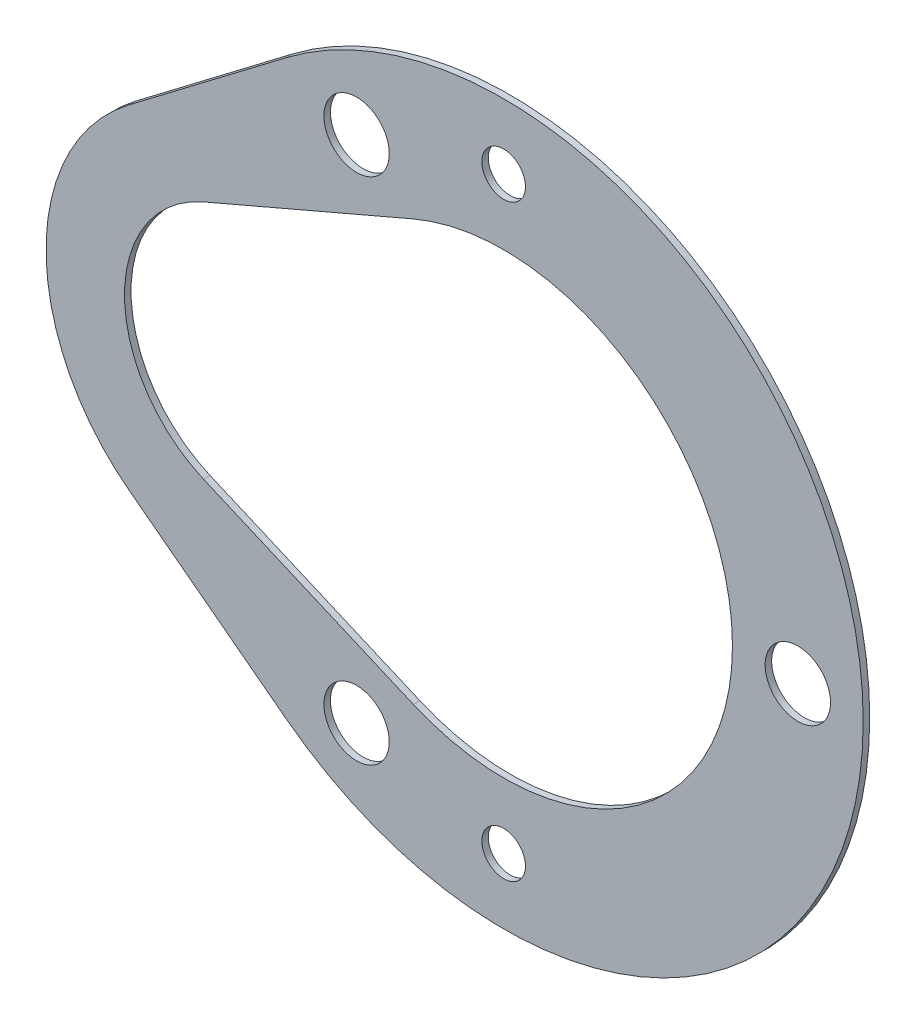
ISO-10303-21;
HEADER;
FILE_DESCRIPTION(('STEP AP214'),'2;1');
FILE_NAME('part.step','',(''),(''),'','','');
FILE_SCHEMA(('AUTOMOTIVE_DESIGN { 1 0 10303 214 1 1 1 1 }'));
ENDSEC;
DATA;
#1=APPLICATION_CONTEXT('core data for automotive mechanical design processes');
#2=APPLICATION_PROTOCOL_DEFINITION('international standard','automotive_design',2000,#1);
#3=PRODUCT_CONTEXT('',#1,'mechanical');
#4=PRODUCT('Part','Part','',(#3));
#5=PRODUCT_RELATED_PRODUCT_CATEGORY('part','',(#4));
#6=PRODUCT_DEFINITION_FORMATION('','',#4);
#7=PRODUCT_DEFINITION_CONTEXT('part definition',#1,'design');
#8=PRODUCT_DEFINITION('design','',#6,#7);
#9=PRODUCT_DEFINITION_SHAPE('','',#8);
#10=(LENGTH_UNIT() NAMED_UNIT(*) SI_UNIT(.MILLI.,.METRE.));
#11=(NAMED_UNIT(*) PLANE_ANGLE_UNIT() SI_UNIT($,.RADIAN.));
#12=(NAMED_UNIT(*) SI_UNIT($,.STERADIAN.) SOLID_ANGLE_UNIT());
#13=UNCERTAINTY_MEASURE_WITH_UNIT(LENGTH_MEASURE(1.E-05),#10,'distance_accuracy_value','');
#14=(GEOMETRIC_REPRESENTATION_CONTEXT(3) GLOBAL_UNCERTAINTY_ASSIGNED_CONTEXT((#13)) GLOBAL_UNIT_ASSIGNED_CONTEXT((#10,
#11,#12)) REPRESENTATION_CONTEXT('',''));
#15=CARTESIAN_POINT('',(0.,0.,0.));
#16=DIRECTION('',(0.,0.,1.));
#17=DIRECTION('',(1.,0.,0.));
#18=AXIS2_PLACEMENT_3D('',#15,#16,#17);
#19=CARTESIAN_POINT('',(-38.0000000000678,0.,1.));
#20=DIRECTION('',(0.,0.,1.));
#21=DIRECTION('',(1.,0.,0.));
#22=AXIS2_PLACEMENT_3D('',#19,#20,#21);
#23=PLANE('',#22);
#24=CARTESIAN_POINT('',(0.,-45.,1.));
#25=DIRECTION('',(0.,0.,1.));
#26=DIRECTION('',(1.,0.,0.));
#27=AXIS2_PLACEMENT_3D('',#24,#25,#26);
#28=CIRCLE('',#27,3.33333333333333);
#29=CARTESIAN_POINT('',(3.33333333333333,-45.,1.));
#30=VERTEX_POINT('',#29);
#31=EDGE_CURVE('E233',#30,#30,#28,.T.);
#32=ORIENTED_EDGE('',*,*,#31,.F.);
#33=EDGE_LOOP('',(#32));
#34=FACE_BOUND('',#33,.T.);
#35=CARTESIAN_POINT('',(0.,45.,1.));
#36=DIRECTION('',(0.,0.,1.));
#37=DIRECTION('',(1.,0.,0.));
#38=AXIS2_PLACEMENT_3D('',#35,#36,#37);
#39=CIRCLE('',#38,3.33333333333333);
#40=CARTESIAN_POINT('',(3.33333333333333,45.,1.));
#41=VERTEX_POINT('',#40);
#42=EDGE_CURVE('E155',#41,#41,#39,.T.);
#43=ORIENTED_EDGE('',*,*,#42,.F.);
#44=EDGE_LOOP('',(#43));
#45=FACE_BOUND('',#44,.T.);
#46=CARTESIAN_POINT('',(45.,0.,1.));
#47=DIRECTION('',(0.,0.,1.));
#48=DIRECTION('',(1.,0.,0.));
#49=AXIS2_PLACEMENT_3D('',#46,#47,#48);
#50=CIRCLE('',#49,4.99999999999204);
#51=CARTESIAN_POINT('',(49.999999999992,0.,1.));
#52=VERTEX_POINT('',#51);
#53=EDGE_CURVE('E179',#52,#52,#50,.T.);
#54=ORIENTED_EDGE('',*,*,#53,.F.);
#55=EDGE_LOOP('',(#54));
#56=FACE_BOUND('',#55,.T.);
#57=CARTESIAN_POINT('',(-38.0000000000678,0.,1.));
#58=DIRECTION('',(0.,0.,1.));
#59=DIRECTION('',(1.,0.,0.));
#60=AXIS2_PLACEMENT_3D('',#57,#58,#59);
#61=CIRCLE('',#60,31.999999978855);
#62=CARTESIAN_POINT('',(-57.3684210279545,25.4728142444692,1.));
#63=VERTEX_POINT('',#62);
#64=CARTESIAN_POINT('',(-57.3684210279545,-25.4728142444692,1.));
#65=VERTEX_POINT('',#64);
#66=EDGE_CURVE('E195',#63,#65,#61,.T.);
#67=ORIENTED_EDGE('',*,*,#66,.T.);
#68=DIRECTION('',(0.796025445665663,-0.605263157521406,0.));
#69=VECTOR('',#68,1.);
#70=CARTESIAN_POINT('',(-57.3684210279545,-25.4728142444692,1.));
#71=LINE('',#70,#69);
#72=CARTESIAN_POINT('',(-33.2894736423173,-43.7813994835193,1.));
#73=VERTEX_POINT('',#72);
#74=EDGE_CURVE('E199',#65,#73,#71,.T.);
#75=ORIENTED_EDGE('',*,*,#74,.T.);
#76=CARTESIAN_POINT('',(0.,0.,1.));
#77=DIRECTION('',(0.,0.,1.));
#78=DIRECTION('',(1.,0.,0.));
#79=AXIS2_PLACEMENT_3D('',#76,#77,#78);
#80=CIRCLE('',#79,54.9999999647095);
#81=CARTESIAN_POINT('',(-33.2894736423173,43.7813994835193,1.));
#82=VERTEX_POINT('',#81);
#83=EDGE_CURVE('E203',#73,#82,#80,.T.);
#84=ORIENTED_EDGE('',*,*,#83,.T.);
#85=DIRECTION('',(-0.796025445665663,-0.605263157521406,0.));
#86=VECTOR('',#85,1.);
#87=CARTESIAN_POINT('',(-57.3684210279545,25.4728142444692,1.));
#88=LINE('',#87,#86);
#89=EDGE_CURVE('E206',#82,#63,#88,.T.);
#90=ORIENTED_EDGE('',*,*,#89,.T.);
#91=EDGE_LOOP('',(#67,#75,#84,#90));
#92=FACE_BOUND('',#91,.T.);
#93=CARTESIAN_POINT('',(-22.5000000000002,38.9711431702724,1.));
#94=DIRECTION('',(0.,0.,1.));
#95=DIRECTION('',(1.,0.,0.));
#96=AXIS2_PLACEMENT_3D('',#93,#94,#95);
#97=CIRCLE('',#96,5.00000000000001);
#98=CARTESIAN_POINT('',(-17.5000000000002,38.9711431702724,1.));
#99=VERTEX_POINT('',#98);
#100=EDGE_CURVE('E187',#99,#99,#97,.T.);
#101=ORIENTED_EDGE('',*,*,#100,.F.);
#102=EDGE_LOOP('',(#101));
#103=FACE_BOUND('',#102,.T.);
#104=CARTESIAN_POINT('',(-22.4999999999996,-38.9711431703272,1.));
#105=DIRECTION('',(0.,0.,1.));
#106=DIRECTION('',(1.,0.,0.));
#107=AXIS2_PLACEMENT_3D('',#104,#105,#106);
#108=CIRCLE('',#107,5.00000000000001);
#109=CARTESIAN_POINT('',(-17.4999999999996,-38.9711431703272,1.));
#110=VERTEX_POINT('',#109);
#111=EDGE_CURVE('E171',#110,#110,#108,.T.);
#112=ORIENTED_EDGE('',*,*,#111,.F.);
#113=EDGE_LOOP('',(#112));
#114=FACE_BOUND('',#113,.T.);
#115=DIRECTION('',(-0.91879422368957,-0.39473684210456,0.));
#116=VECTOR('',#115,1.);
#117=CARTESIAN_POINT('',(-45.8947368421589,18.3758844737914,1.));
#118=LINE('',#117,#116);
#119=CARTESIAN_POINT('',(-13.8157894736596,32.157797829135,1.));
#120=VERTEX_POINT('',#119);
#121=CARTESIAN_POINT('',(-45.8947368421589,18.3758844737914,1.));
#122=VERTEX_POINT('',#121);
#123=EDGE_CURVE('E130',#120,#122,#118,.T.);
#124=ORIENTED_EDGE('',*,*,#123,.F.);
#125=CARTESIAN_POINT('',(0.,0.,1.));
#126=DIRECTION('',(0.,0.,1.));
#127=DIRECTION('',(1.,0.,0.));
#128=AXIS2_PLACEMENT_3D('',#125,#126,#127);
#129=CIRCLE('',#128,35.);
#130=CARTESIAN_POINT('',(-13.8157894736596,-32.157797829135,1.));
#131=VERTEX_POINT('',#130);
#132=EDGE_CURVE('E121',#131,#120,#129,.T.);
#133=ORIENTED_EDGE('',*,*,#132,.F.);
#134=DIRECTION('',(0.91879422368957,-0.39473684210456,0.));
#135=VECTOR('',#134,1.);
#136=CARTESIAN_POINT('',(-45.8947368421589,-18.3758844737914,1.));
#137=LINE('',#136,#135);
#138=CARTESIAN_POINT('',(-45.8947368421589,-18.3758844737914,1.));
#139=VERTEX_POINT('',#138);
#140=EDGE_CURVE('E147',#139,#131,#137,.T.);
#141=ORIENTED_EDGE('',*,*,#140,.F.);
#142=CARTESIAN_POINT('',(-38.0000000000678,0.,1.));
#143=DIRECTION('',(0.,0.,1.));
#144=DIRECTION('',(1.,0.,0.));
#145=AXIS2_PLACEMENT_3D('',#142,#143,#144);
#146=CIRCLE('',#145,20.);
#147=EDGE_CURVE('E143',#122,#139,#146,.T.);
#148=ORIENTED_EDGE('',*,*,#147,.F.);
#149=EDGE_LOOP('',(#124,#133,#141,#148));
#150=FACE_BOUND('',#149,.T.);
#151=ADVANCED_FACE('F53',(#34,#45,#56,#92,#103,#114,#150),#23,.T.);
#152=CARTESIAN_POINT('',(-38.0000000000678,0.,0.));
#153=DIRECTION('',(0.,0.,1.));
#154=DIRECTION('',(1.,0.,0.));
#155=AXIS2_PLACEMENT_3D('',#152,#153,#154);
#156=PLANE('',#155);
#157=CARTESIAN_POINT('',(0.,-45.,0.));
#158=DIRECTION('',(0.,0.,1.));
#159=DIRECTION('',(1.,0.,0.));
#160=AXIS2_PLACEMENT_3D('',#157,#158,#159);
#161=CIRCLE('',#160,3.35);
#162=CARTESIAN_POINT('',(3.35,-45.,0.));
#163=VERTEX_POINT('',#162);
#164=EDGE_CURVE('E57',#163,#163,#161,.T.);
#165=ORIENTED_EDGE('',*,*,#164,.T.);
#166=EDGE_LOOP('',(#165));
#167=FACE_BOUND('',#166,.T.);
#168=CARTESIAN_POINT('',(0.,45.,0.));
#169=DIRECTION('',(0.,0.,1.));
#170=DIRECTION('',(1.,0.,0.));
#171=AXIS2_PLACEMENT_3D('',#168,#169,#170);
#172=CIRCLE('',#171,3.35);
#173=CARTESIAN_POINT('',(3.35,45.,0.));
#174=VERTEX_POINT('',#173);
#175=EDGE_CURVE('E230',#174,#174,#172,.T.);
#176=ORIENTED_EDGE('',*,*,#175,.T.);
#177=EDGE_LOOP('',(#176));
#178=FACE_BOUND('',#177,.T.);
#179=CARTESIAN_POINT('',(-22.4999999999996,-38.9711431703272,0.));
#180=DIRECTION('',(0.,0.,1.));
#181=DIRECTION('',(1.,0.,0.));
#182=AXIS2_PLACEMENT_3D('',#179,#180,#181);
#183=CIRCLE('',#182,5.00000000000001);
#184=CARTESIAN_POINT('',(-17.4999999999996,-38.9711431703272,0.));
#185=VERTEX_POINT('',#184);
#186=EDGE_CURVE('E139',#185,#185,#183,.T.);
#187=ORIENTED_EDGE('',*,*,#186,.T.);
#188=EDGE_LOOP('',(#187));
#189=FACE_BOUND('',#188,.T.);
#190=CARTESIAN_POINT('',(45.,0.,0.));
#191=DIRECTION('',(0.,0.,1.));
#192=DIRECTION('',(1.,0.,0.));
#193=AXIS2_PLACEMENT_3D('',#190,#191,#192);
#194=CIRCLE('',#193,4.99999999999204);
#195=CARTESIAN_POINT('',(49.999999999992,0.,0.));
#196=VERTEX_POINT('',#195);
#197=EDGE_CURVE('E175',#196,#196,#194,.T.);
#198=ORIENTED_EDGE('',*,*,#197,.T.);
#199=EDGE_LOOP('',(#198));
#200=FACE_BOUND('',#199,.T.);
#201=CARTESIAN_POINT('',(-22.5000000000002,38.9711431702724,0.));
#202=DIRECTION('',(0.,0.,1.));
#203=DIRECTION('',(1.,0.,0.));
#204=AXIS2_PLACEMENT_3D('',#201,#202,#203);
#205=CIRCLE('',#204,5.00000000000001);
#206=CARTESIAN_POINT('',(-17.5000000000002,38.9711431702724,0.));
#207=VERTEX_POINT('',#206);
#208=EDGE_CURVE('E183',#207,#207,#205,.T.);
#209=ORIENTED_EDGE('',*,*,#208,.T.);
#210=EDGE_LOOP('',(#209));
#211=FACE_BOUND('',#210,.T.);
#212=CARTESIAN_POINT('',(-38.0000000000678,0.,0.));
#213=DIRECTION('',(0.,0.,1.));
#214=DIRECTION('',(1.,0.,0.));
#215=AXIS2_PLACEMENT_3D('',#212,#213,#214);
#216=CIRCLE('',#215,31.999999978855);
#217=CARTESIAN_POINT('',(-57.3684210279545,25.4728142444692,0.));
#218=VERTEX_POINT('',#217);
#219=CARTESIAN_POINT('',(-57.3684210279545,-25.4728142444692,0.));
#220=VERTEX_POINT('',#219);
#221=EDGE_CURVE('E191',#218,#220,#216,.T.);
#222=ORIENTED_EDGE('',*,*,#221,.F.);
#223=DIRECTION('',(-0.796025445665663,-0.605263157521406,0.));
#224=VECTOR('',#223,1.);
#225=CARTESIAN_POINT('',(-57.3684210279545,25.4728142444692,0.));
#226=LINE('',#225,#224);
#227=CARTESIAN_POINT('',(-33.2894736423173,43.7813994835193,0.));
#228=VERTEX_POINT('',#227);
#229=EDGE_CURVE('E200',#228,#218,#226,.T.);
#230=ORIENTED_EDGE('',*,*,#229,.F.);
#231=CARTESIAN_POINT('',(0.,0.,0.));
#232=DIRECTION('',(0.,0.,1.));
#233=DIRECTION('',(1.,0.,0.));
#234=AXIS2_PLACEMENT_3D('',#231,#232,#233);
#235=CIRCLE('',#234,54.9999999647095);
#236=CARTESIAN_POINT('',(-33.2894736423173,-43.7813994835193,0.));
#237=VERTEX_POINT('',#236);
#238=EDGE_CURVE('E216',#237,#228,#235,.T.);
#239=ORIENTED_EDGE('',*,*,#238,.F.);
#240=DIRECTION('',(0.796025445665663,-0.605263157521406,0.));
#241=VECTOR('',#240,1.);
#242=CARTESIAN_POINT('',(-57.3684210279545,-25.4728142444692,0.));
#243=LINE('',#242,#241);
#244=EDGE_CURVE('E213',#220,#237,#243,.T.);
#245=ORIENTED_EDGE('',*,*,#244,.F.);
#246=EDGE_LOOP('',(#222,#230,#239,#245));
#247=FACE_BOUND('',#246,.T.);
#248=CARTESIAN_POINT('',(0.,0.,0.));
#249=DIRECTION('',(0.,0.,1.));
#250=DIRECTION('',(1.,0.,0.));
#251=AXIS2_PLACEMENT_3D('',#248,#249,#250);
#252=CIRCLE('',#251,35.);
#253=CARTESIAN_POINT('',(-13.8157894736596,-32.157797829135,0.));
#254=VERTEX_POINT('',#253);
#255=CARTESIAN_POINT('',(-13.8157894736596,32.157797829135,0.));
#256=VERTEX_POINT('',#255);
#257=EDGE_CURVE('E79',#254,#256,#252,.T.);
#258=ORIENTED_EDGE('',*,*,#257,.T.);
#259=DIRECTION('',(-0.91879422368957,-0.39473684210456,0.));
#260=VECTOR('',#259,1.);
#261=CARTESIAN_POINT('',(-45.8947368421589,18.3758844737914,0.));
#262=LINE('',#261,#260);
#263=CARTESIAN_POINT('',(-45.8947368421589,18.3758844737914,0.));
#264=VERTEX_POINT('',#263);
#265=EDGE_CURVE('E137',#256,#264,#262,.T.);
#266=ORIENTED_EDGE('',*,*,#265,.T.);
#267=CARTESIAN_POINT('',(-38.0000000000678,0.,0.));
#268=DIRECTION('',(0.,0.,1.));
#269=DIRECTION('',(1.,0.,0.));
#270=AXIS2_PLACEMENT_3D('',#267,#268,#269);
#271=CIRCLE('',#270,20.);
#272=CARTESIAN_POINT('',(-45.8947368421589,-18.3758844737914,0.));
#273=VERTEX_POINT('',#272);
#274=EDGE_CURVE('E158',#264,#273,#271,.T.);
#275=ORIENTED_EDGE('',*,*,#274,.T.);
#276=DIRECTION('',(0.91879422368957,-0.39473684210456,0.));
#277=VECTOR('',#276,1.);
#278=CARTESIAN_POINT('',(-45.8947368421589,-18.3758844737914,0.));
#279=LINE('',#278,#277);
#280=EDGE_CURVE('E131',#273,#254,#279,.T.);
#281=ORIENTED_EDGE('',*,*,#280,.T.);
#282=EDGE_LOOP('',(#258,#266,#275,#281));
#283=FACE_BOUND('',#282,.T.);
#284=ADVANCED_FACE('F247',(#167,#178,#189,#200,#211,#247,#283),#156,.F.);
#285=CARTESIAN_POINT('',(-38.0000000000678,0.,1.));
#286=DIRECTION('',(0.,0.,-1.));
#287=DIRECTION('',(-1.,0.,0.));
#288=AXIS2_PLACEMENT_3D('',#285,#286,#287);
#289=CYLINDRICAL_SURFACE('',#288,31.999999978855);
#290=ORIENTED_EDGE('',*,*,#221,.T.);
#291=DIRECTION('',(0.,0.,-1.));
#292=VECTOR('',#291,1.);
#293=CARTESIAN_POINT('',(-57.3684210279545,-25.4728142444692,1.));
#294=LINE('',#293,#292);
#295=EDGE_CURVE('E12',#65,#220,#294,.T.);
#296=ORIENTED_EDGE('',*,*,#295,.F.);
#297=ORIENTED_EDGE('',*,*,#66,.F.);
#298=DIRECTION('',(0.,0.,-1.));
#299=VECTOR('',#298,1.);
#300=CARTESIAN_POINT('',(-57.3684210279545,25.4728142444692,1.));
#301=LINE('',#300,#299);
#302=EDGE_CURVE('E209',#63,#218,#301,.T.);
#303=ORIENTED_EDGE('',*,*,#302,.T.);
#304=EDGE_LOOP('',(#290,#296,#297,#303));
#305=FACE_BOUND('',#304,.T.);
#306=ADVANCED_FACE('F55',(#305),#289,.T.);
#307=CARTESIAN_POINT('',(-57.3684210279545,-25.4728142444692,1.));
#308=DIRECTION('',(0.605263157521406,0.796025445665663,0.));
#309=DIRECTION('',(-0.796025445665663,0.605263157521406,0.));
#310=AXIS2_PLACEMENT_3D('',#307,#308,#309);
#311=PLANE('',#310);
#312=ORIENTED_EDGE('',*,*,#244,.T.);
#313=DIRECTION('',(0.,0.,-1.));
#314=VECTOR('',#313,1.);
#315=CARTESIAN_POINT('',(-33.2894736423173,-43.7813994835193,1.));
#316=LINE('',#315,#314);
#317=EDGE_CURVE('E63',#73,#237,#316,.T.);
#318=ORIENTED_EDGE('',*,*,#317,.F.);
#319=ORIENTED_EDGE('',*,*,#74,.F.);
#320=ORIENTED_EDGE('',*,*,#295,.T.);
#321=EDGE_LOOP('',(#312,#318,#319,#320));
#322=FACE_BOUND('',#321,.T.);
#323=ADVANCED_FACE('F277',(#322),#311,.F.);
#324=CARTESIAN_POINT('',(0.,0.,1.));
#325=DIRECTION('',(0.,0.,-1.));
#326=DIRECTION('',(-1.,0.,0.));
#327=AXIS2_PLACEMENT_3D('',#324,#325,#326);
#328=CYLINDRICAL_SURFACE('',#327,54.9999999647095);
#329=ORIENTED_EDGE('',*,*,#238,.T.);
#330=DIRECTION('',(0.,0.,-1.));
#331=VECTOR('',#330,1.);
#332=CARTESIAN_POINT('',(-33.2894736423173,43.7813994835193,1.));
#333=LINE('',#332,#331);
#334=EDGE_CURVE('E224',#82,#228,#333,.T.);
#335=ORIENTED_EDGE('',*,*,#334,.F.);
#336=ORIENTED_EDGE('',*,*,#83,.F.);
#337=ORIENTED_EDGE('',*,*,#317,.T.);
#338=EDGE_LOOP('',(#329,#335,#336,#337));
#339=FACE_BOUND('',#338,.T.);
#340=ADVANCED_FACE('F274',(#339),#328,.T.);
#341=CARTESIAN_POINT('',(-57.3684210279545,25.4728142444692,1.));
#342=DIRECTION('',(0.605263157521406,-0.796025445665663,0.));
#343=DIRECTION('',(0.796025445665663,0.605263157521406,0.));
#344=AXIS2_PLACEMENT_3D('',#341,#342,#343);
#345=PLANE('',#344);
#346=ORIENTED_EDGE('',*,*,#229,.T.);
#347=ORIENTED_EDGE('',*,*,#302,.F.);
#348=ORIENTED_EDGE('',*,*,#89,.F.);
#349=ORIENTED_EDGE('',*,*,#334,.T.);
#350=EDGE_LOOP('',(#346,#347,#348,#349));
#351=FACE_BOUND('',#350,.T.);
#352=ADVANCED_FACE('F271',(#351),#345,.F.);
#353=CARTESIAN_POINT('',(-22.5000000000002,38.9711431702724,1.));
#354=DIRECTION('',(0.,0.,-1.));
#355=DIRECTION('',(-1.,0.,0.));
#356=AXIS2_PLACEMENT_3D('',#353,#354,#355);
#357=CYLINDRICAL_SURFACE('',#356,5.00000000000001);
#358=ORIENTED_EDGE('',*,*,#100,.T.);
#359=EDGE_LOOP('',(#358));
#360=FACE_BOUND('',#359,.T.);
#361=ORIENTED_EDGE('',*,*,#208,.F.);
#362=EDGE_LOOP('',(#361));
#363=FACE_BOUND('',#362,.T.);
#364=ADVANCED_FACE('F268',(#360,#363),#357,.F.);
#365=CARTESIAN_POINT('',(45.,0.,1.));
#366=DIRECTION('',(0.,0.,-1.));
#367=DIRECTION('',(-1.,0.,0.));
#368=AXIS2_PLACEMENT_3D('',#365,#366,#367);
#369=CYLINDRICAL_SURFACE('',#368,4.99999999999204);
#370=ORIENTED_EDGE('',*,*,#53,.T.);
#371=EDGE_LOOP('',(#370));
#372=FACE_BOUND('',#371,.T.);
#373=ORIENTED_EDGE('',*,*,#197,.F.);
#374=EDGE_LOOP('',(#373));
#375=FACE_BOUND('',#374,.T.);
#376=ADVANCED_FACE('F306',(#372,#375),#369,.F.);
#377=CARTESIAN_POINT('',(-22.4999999999996,-38.9711431703272,1.));
#378=DIRECTION('',(0.,0.,-1.));
#379=DIRECTION('',(-1.,0.,0.));
#380=AXIS2_PLACEMENT_3D('',#377,#378,#379);
#381=CYLINDRICAL_SURFACE('',#380,5.00000000000001);
#382=ORIENTED_EDGE('',*,*,#111,.T.);
#383=EDGE_LOOP('',(#382));
#384=FACE_BOUND('',#383,.T.);
#385=ORIENTED_EDGE('',*,*,#186,.F.);
#386=EDGE_LOOP('',(#385));
#387=FACE_BOUND('',#386,.T.);
#388=ADVANCED_FACE('F303',(#384,#387),#381,.F.);
#389=CARTESIAN_POINT('',(0.,0.,1.));
#390=DIRECTION('',(0.,0.,-1.));
#391=DIRECTION('',(-1.,0.,0.));
#392=AXIS2_PLACEMENT_3D('',#389,#390,#391);
#393=CYLINDRICAL_SURFACE('',#392,35.);
#394=ORIENTED_EDGE('',*,*,#257,.F.);
#395=DIRECTION('',(0.,0.,-1.));
#396=VECTOR('',#395,1.);
#397=CARTESIAN_POINT('',(-13.8157894736596,-32.157797829135,1.));
#398=LINE('',#397,#396);
#399=EDGE_CURVE('E125',#131,#254,#398,.T.);
#400=ORIENTED_EDGE('',*,*,#399,.F.);
#401=ORIENTED_EDGE('',*,*,#132,.T.);
#402=DIRECTION('',(0.,0.,-1.));
#403=VECTOR('',#402,1.);
#404=CARTESIAN_POINT('',(-13.8157894736596,32.157797829135,1.));
#405=LINE('',#404,#403);
#406=EDGE_CURVE('E124',#120,#256,#405,.T.);
#407=ORIENTED_EDGE('',*,*,#406,.T.);
#408=EDGE_LOOP('',(#394,#400,#401,#407));
#409=FACE_BOUND('',#408,.T.);
#410=ADVANCED_FACE('F123',(#409),#393,.F.);
#411=CARTESIAN_POINT('',(-45.8947368421589,18.3758844737914,1.));
#412=DIRECTION('',(0.39473684210456,-0.91879422368957,0.));
#413=DIRECTION('',(0.91879422368957,0.39473684210456,0.));
#414=AXIS2_PLACEMENT_3D('',#411,#412,#413);
#415=PLANE('',#414);
#416=ORIENTED_EDGE('',*,*,#265,.F.);
#417=ORIENTED_EDGE('',*,*,#406,.F.);
#418=ORIENTED_EDGE('',*,*,#123,.T.);
#419=DIRECTION('',(0.,0.,-1.));
#420=VECTOR('',#419,1.);
#421=CARTESIAN_POINT('',(-45.8947368421589,18.3758844737914,1.));
#422=LINE('',#421,#420);
#423=EDGE_CURVE('E140',#122,#264,#422,.T.);
#424=ORIENTED_EDGE('',*,*,#423,.T.);
#425=EDGE_LOOP('',(#416,#417,#418,#424));
#426=FACE_BOUND('',#425,.T.);
#427=ADVANCED_FACE('F134',(#426),#415,.T.);
#428=CARTESIAN_POINT('',(-38.0000000000678,0.,1.));
#429=DIRECTION('',(0.,0.,-1.));
#430=DIRECTION('',(-1.,0.,0.));
#431=AXIS2_PLACEMENT_3D('',#428,#429,#430);
#432=CYLINDRICAL_SURFACE('',#431,20.);
#433=ORIENTED_EDGE('',*,*,#274,.F.);
#434=ORIENTED_EDGE('',*,*,#423,.F.);
#435=ORIENTED_EDGE('',*,*,#147,.T.);
#436=DIRECTION('',(0.,0.,-1.));
#437=VECTOR('',#436,1.);
#438=CARTESIAN_POINT('',(-45.8947368421589,-18.3758844737914,1.));
#439=LINE('',#438,#437);
#440=EDGE_CURVE('E71',#139,#273,#439,.T.);
#441=ORIENTED_EDGE('',*,*,#440,.T.);
#442=EDGE_LOOP('',(#433,#434,#435,#441));
#443=FACE_BOUND('',#442,.T.);
#444=ADVANCED_FACE('F329',(#443),#432,.F.);
#445=CARTESIAN_POINT('',(-45.8947368421589,-18.3758844737914,1.));
#446=DIRECTION('',(0.39473684210456,0.91879422368957,0.));
#447=DIRECTION('',(-0.91879422368957,0.39473684210456,0.));
#448=AXIS2_PLACEMENT_3D('',#445,#446,#447);
#449=PLANE('',#448);
#450=ORIENTED_EDGE('',*,*,#280,.F.);
#451=ORIENTED_EDGE('',*,*,#440,.F.);
#452=ORIENTED_EDGE('',*,*,#140,.T.);
#453=ORIENTED_EDGE('',*,*,#399,.T.);
#454=EDGE_LOOP('',(#450,#451,#452,#453));
#455=FACE_BOUND('',#454,.T.);
#456=ADVANCED_FACE('F256',(#455),#449,.T.);
#457=CARTESIAN_POINT('',(0.,45.,21.));
#458=DIRECTION('',(0.,0.,-1.));
#459=DIRECTION('',(-1.,0.,0.));
#460=AXIS2_PLACEMENT_3D('',#457,#458,#459);
#461=CONICAL_SURFACE('',#460,3.,0.0166651237139407);
#462=ORIENTED_EDGE('',*,*,#42,.T.);
#463=EDGE_LOOP('',(#462));
#464=FACE_BOUND('',#463,.T.);
#465=ORIENTED_EDGE('',*,*,#175,.F.);
#466=EDGE_LOOP('',(#465));
#467=FACE_BOUND('',#466,.T.);
#468=ADVANCED_FACE('F251',(#464,#467),#461,.F.);
#469=CARTESIAN_POINT('',(0.,-45.,21.));
#470=DIRECTION('',(0.,0.,-1.));
#471=DIRECTION('',(-1.,0.,0.));
#472=AXIS2_PLACEMENT_3D('',#469,#470,#471);
#473=CONICAL_SURFACE('',#472,3.,0.0166651237139407);
#474=ORIENTED_EDGE('',*,*,#31,.T.);
#475=EDGE_LOOP('',(#474));
#476=FACE_BOUND('',#475,.T.);
#477=ORIENTED_EDGE('',*,*,#164,.F.);
#478=EDGE_LOOP('',(#477));
#479=FACE_BOUND('',#478,.T.);
#480=ADVANCED_FACE('F249',(#476,#479),#473,.F.);
#481=CLOSED_SHELL('',(#151,#284,#306,#323,#340,#352,#364,#376,#388,#410,#427,#444,#456,#468,#480));
#482=MANIFOLD_SOLID_BREP('B2',#481);
#483=ADVANCED_BREP_SHAPE_REPRESENTATION('',(#18,#482),#14);
#484=SHAPE_DEFINITION_REPRESENTATION(#9,#483);
ENDSEC;
END-ISO-10303-21;
